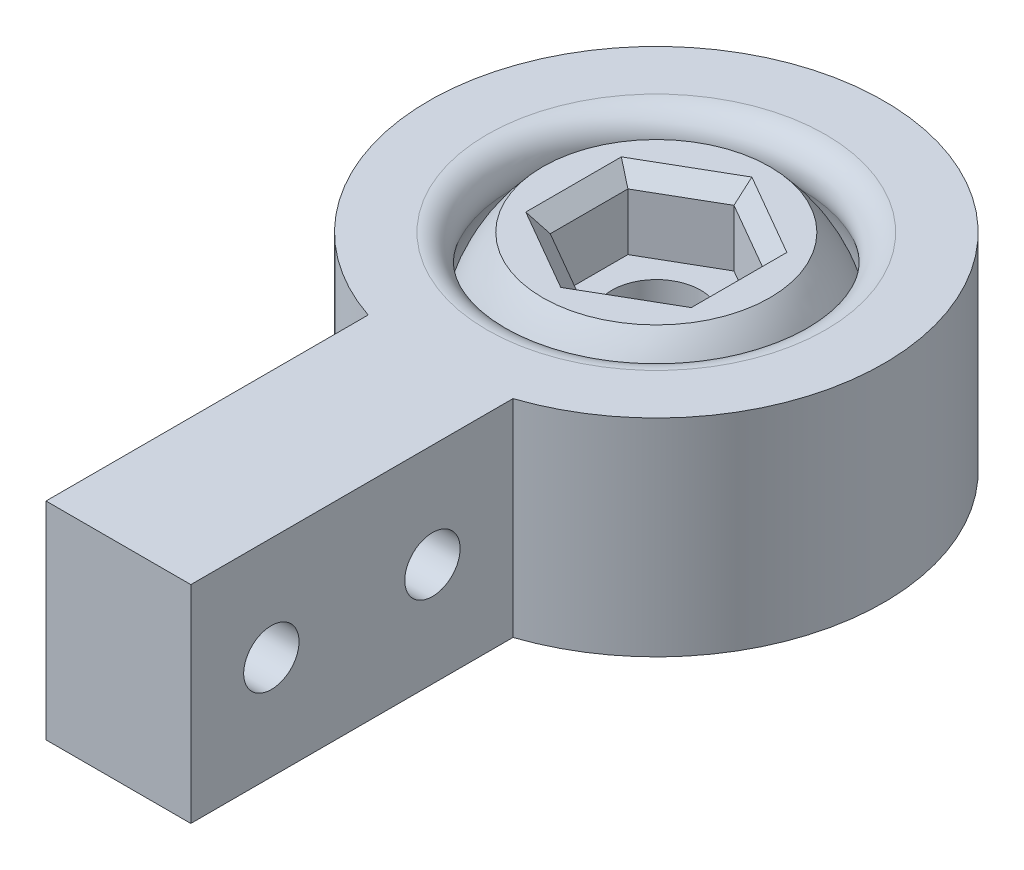
ISO-10303-21;
HEADER;
FILE_DESCRIPTION(('STEP AP214'),'2;1');
FILE_NAME('part.step','',(''),(''),'','','');
FILE_SCHEMA(('AUTOMOTIVE_DESIGN { 1 0 10303 214 1 1 1 1 }'));
ENDSEC;
DATA;
#1=APPLICATION_CONTEXT('core data for automotive mechanical design processes');
#2=APPLICATION_PROTOCOL_DEFINITION('international standard','automotive_design',2000,#1);
#3=PRODUCT_CONTEXT('',#1,'mechanical');
#4=PRODUCT('Part','Part','',(#3));
#5=PRODUCT_RELATED_PRODUCT_CATEGORY('part','',(#4));
#6=PRODUCT_DEFINITION_FORMATION('','',#4);
#7=PRODUCT_DEFINITION_CONTEXT('part definition',#1,'design');
#8=PRODUCT_DEFINITION('design','',#6,#7);
#9=PRODUCT_DEFINITION_SHAPE('','',#8);
#10=(LENGTH_UNIT() NAMED_UNIT(*) SI_UNIT(.MILLI.,.METRE.));
#11=(NAMED_UNIT(*) PLANE_ANGLE_UNIT() SI_UNIT($,.RADIAN.));
#12=(NAMED_UNIT(*) SI_UNIT($,.STERADIAN.) SOLID_ANGLE_UNIT());
#13=UNCERTAINTY_MEASURE_WITH_UNIT(LENGTH_MEASURE(1.E-05),#10,'distance_accuracy_value','');
#14=(GEOMETRIC_REPRESENTATION_CONTEXT(3) GLOBAL_UNCERTAINTY_ASSIGNED_CONTEXT((#13)) GLOBAL_UNIT_ASSIGNED_CONTEXT((#10,
#11,#12)) REPRESENTATION_CONTEXT('',''));
#15=CARTESIAN_POINT('',(0.,0.,0.));
#16=DIRECTION('',(0.,0.,1.));
#17=DIRECTION('',(1.,0.,0.));
#18=AXIS2_PLACEMENT_3D('',#15,#16,#17);
#19=CARTESIAN_POINT('',(0.,0.,0.));
#20=DIRECTION('',(0.,0.,-1.));
#21=DIRECTION('',(1.,0.,0.));
#22=AXIS2_PLACEMENT_3D('',#19,#20,#21);
#23=SPHERICAL_SURFACE('',#22,14.85);
#24=CARTESIAN_POINT('',(0.,0.,0.));
#25=DIRECTION('',(0.,1.,0.));
#26=DIRECTION('',(0.,0.,1.));
#27=AXIS2_PLACEMENT_3D('',#24,#25,#26);
#28=SPHERICAL_SURFACE('',#27,14.85);
#29=CARTESIAN_POINT('',(0.,10.,0.));
#30=DIRECTION('',(0.,1.,0.));
#31=DIRECTION('',(0.,0.,1.));
#32=AXIS2_PLACEMENT_3D('',#29,#30,#31);
#33=CIRCLE('',#32,10.9782739991312);
#34=CARTESIAN_POINT('',(0.,10.,10.9782739991312));
#35=VERTEX_POINT('',#34);
#36=EDGE_CURVE('E173',#35,#35,#33,.T.);
#37=ORIENTED_EDGE('',*,*,#36,.F.);
#38=EDGE_LOOP('',(#37));
#39=FACE_BOUND('',#38,.T.);
#40=CARTESIAN_POINT('',(0.,-10.,0.));
#41=DIRECTION('',(0.,-1.,0.));
#42=DIRECTION('',(0.,0.,-1.));
#43=AXIS2_PLACEMENT_3D('',#40,#41,#42);
#44=CIRCLE('',#43,10.9782739991312);
#45=CARTESIAN_POINT('',(0.,-10.,-10.9782739991312));
#46=VERTEX_POINT('',#45);
#47=EDGE_CURVE('E163',#46,#46,#44,.T.);
#48=ORIENTED_EDGE('',*,*,#47,.F.);
#49=EDGE_LOOP('',(#48));
#50=FACE_BOUND('',#49,.T.);
#51=ADVANCED_FACE('F54',(#39,#50),#28,.T.);
#52=CARTESIAN_POINT('',(0.,10.,0.));
#53=DIRECTION('',(0.,1.,0.));
#54=DIRECTION('',(0.,0.,1.));
#55=AXIS2_PLACEMENT_3D('',#52,#53,#54);
#56=PLANE('',#55);
#57=DIRECTION('',(0.,0.,1.));
#58=VECTOR('',#57,1.);
#59=CARTESIAN_POINT('',(8.,10.,3.75277674973257));
#60=LINE('',#59,#58);
#61=CARTESIAN_POINT('',(8.,10.,-4.61880215351701));
#62=VERTEX_POINT('',#61);
#63=CARTESIAN_POINT('',(8.,10.,4.61880215351701));
#64=VERTEX_POINT('',#63);
#65=EDGE_CURVE('E185',#62,#64,#60,.T.);
#66=ORIENTED_EDGE('',*,*,#65,.T.);
#67=DIRECTION('',(-0.866025403784439,0.,0.5));
#68=VECTOR('',#67,1.);
#69=CARTESIAN_POINT('',(0.749999999999999,10.,8.80459160514179));
#70=LINE('',#69,#68);
#71=CARTESIAN_POINT('',(0.,10.,9.23760430703401));
#72=VERTEX_POINT('',#71);
#73=EDGE_CURVE('E195',#64,#72,#70,.T.);
#74=ORIENTED_EDGE('',*,*,#73,.T.);
#75=DIRECTION('',(-0.866025403784439,0.,-0.5));
#76=VECTOR('',#75,1.);
#77=CARTESIAN_POINT('',(-7.25,10.,5.05181485540923));
#78=LINE('',#77,#76);
#79=CARTESIAN_POINT('',(-8.,10.,4.61880215351701));
#80=VERTEX_POINT('',#79);
#81=EDGE_CURVE('E193',#72,#80,#78,.T.);
#82=ORIENTED_EDGE('',*,*,#81,.T.);
#83=DIRECTION('',(0.,0.,-1.));
#84=VECTOR('',#83,1.);
#85=CARTESIAN_POINT('',(-8.,10.,-3.75277674973257));
#86=LINE('',#85,#84);
#87=CARTESIAN_POINT('',(-8.,10.,-4.61880215351701));
#88=VERTEX_POINT('',#87);
#89=EDGE_CURVE('E191',#80,#88,#86,.T.);
#90=ORIENTED_EDGE('',*,*,#89,.T.);
#91=DIRECTION('',(0.866025403784439,0.,-0.5));
#92=VECTOR('',#91,1.);
#93=CARTESIAN_POINT('',(-0.750000000000001,10.,-8.8045916051418));
#94=LINE('',#93,#92);
#95=CARTESIAN_POINT('',(0.,10.,-9.23760430703402));
#96=VERTEX_POINT('',#95);
#97=EDGE_CURVE('E189',#88,#96,#94,.T.);
#98=ORIENTED_EDGE('',*,*,#97,.T.);
#99=DIRECTION('',(0.866025403784439,0.,0.5));
#100=VECTOR('',#99,1.);
#101=CARTESIAN_POINT('',(7.25,10.,-5.05181485540923));
#102=LINE('',#101,#100);
#103=EDGE_CURVE('E187',#96,#62,#102,.T.);
#104=ORIENTED_EDGE('',*,*,#103,.T.);
#105=EDGE_LOOP('',(#66,#74,#82,#90,#98,#104));
#106=FACE_BOUND('',#105,.T.);
#107=ORIENTED_EDGE('',*,*,#36,.T.);
#108=EDGE_LOOP('',(#107));
#109=FACE_BOUND('',#108,.T.);
#110=ADVANCED_FACE('F229',(#106,#109),#56,.T.);
#111=CARTESIAN_POINT('',(0.,-10.,0.));
#112=DIRECTION('',(0.,-1.,0.));
#113=DIRECTION('',(0.,0.,-1.));
#114=AXIS2_PLACEMENT_3D('',#111,#112,#113);
#115=PLANE('',#114);
#116=CARTESIAN_POINT('',(0.,-10.,0.));
#117=DIRECTION('',(0.,-1.,0.));
#118=DIRECTION('',(0.,0.,-1.));
#119=AXIS2_PLACEMENT_3D('',#116,#117,#118);
#120=CIRCLE('',#119,7.62102355330306);
#121=CARTESIAN_POINT('',(0.,-10.,-7.62102355330306));
#122=VERTEX_POINT('',#121);
#123=EDGE_CURVE('E150',#122,#122,#120,.T.);
#124=ORIENTED_EDGE('',*,*,#123,.F.);
#125=EDGE_LOOP('',(#124));
#126=FACE_BOUND('',#125,.T.);
#127=ORIENTED_EDGE('',*,*,#47,.T.);
#128=EDGE_LOOP('',(#127));
#129=FACE_BOUND('',#128,.T.);
#130=ADVANCED_FACE('F262',(#126,#129),#115,.T.);
#131=CARTESIAN_POINT('',(0.,3.,0.));
#132=DIRECTION('',(0.,1.,0.));
#133=DIRECTION('',(0.,0.,1.));
#134=AXIS2_PLACEMENT_3D('',#131,#132,#133);
#135=PLANE('',#134);
#136=CARTESIAN_POINT('',(0.,3.,0.));
#137=DIRECTION('',(0.,1.,0.));
#138=DIRECTION('',(0.,0.,1.));
#139=AXIS2_PLACEMENT_3D('',#136,#137,#138);
#140=CIRCLE('',#139,4.3);
#141=CARTESIAN_POINT('',(0.,3.,4.3));
#142=VERTEX_POINT('',#141);
#143=EDGE_CURVE('E182',#142,#142,#140,.F.);
#144=ORIENTED_EDGE('',*,*,#143,.T.);
#145=EDGE_LOOP('',(#144));
#146=FACE_BOUND('',#145,.T.);
#147=DIRECTION('',(-0.866025403784439,0.,-0.5));
#148=VECTOR('',#147,1.);
#149=CARTESIAN_POINT('',(6.5,3.,-3.75277674973257));
#150=LINE('',#149,#148);
#151=CARTESIAN_POINT('',(6.5,3.,-3.75277674973257));
#152=VERTEX_POINT('',#151);
#153=CARTESIAN_POINT('',(0.,3.,-7.50555349946514));
#154=VERTEX_POINT('',#153);
#155=EDGE_CURVE('E128',#152,#154,#150,.T.);
#156=ORIENTED_EDGE('',*,*,#155,.T.);
#157=DIRECTION('',(-0.866025403784439,0.,0.5));
#158=VECTOR('',#157,1.);
#159=CARTESIAN_POINT('',(0.,3.,-7.50555349946514));
#160=LINE('',#159,#158);
#161=CARTESIAN_POINT('',(-6.5,3.,-3.75277674973257));
#162=VERTEX_POINT('',#161);
#163=EDGE_CURVE('E136',#154,#162,#160,.T.);
#164=ORIENTED_EDGE('',*,*,#163,.T.);
#165=DIRECTION('',(0.,0.,1.));
#166=VECTOR('',#165,1.);
#167=CARTESIAN_POINT('',(-6.5,3.,-3.75277674973257));
#168=LINE('',#167,#166);
#169=CARTESIAN_POINT('',(-6.5,3.,3.75277674973257));
#170=VERTEX_POINT('',#169);
#171=EDGE_CURVE('E142',#162,#170,#168,.T.);
#172=ORIENTED_EDGE('',*,*,#171,.T.);
#173=DIRECTION('',(0.866025403784439,0.,0.5));
#174=VECTOR('',#173,1.);
#175=CARTESIAN_POINT('',(-6.5,3.,3.75277674973257));
#176=LINE('',#175,#174);
#177=CARTESIAN_POINT('',(0.,3.,7.50555349946514));
#178=VERTEX_POINT('',#177);
#179=EDGE_CURVE('E155',#170,#178,#176,.T.);
#180=ORIENTED_EDGE('',*,*,#179,.T.);
#181=DIRECTION('',(0.866025403784439,0.,-0.5));
#182=VECTOR('',#181,1.);
#183=CARTESIAN_POINT('',(0.,3.,7.50555349946514));
#184=LINE('',#183,#182);
#185=CARTESIAN_POINT('',(6.5,3.,3.75277674973257));
#186=VERTEX_POINT('',#185);
#187=EDGE_CURVE('E158',#178,#186,#184,.T.);
#188=ORIENTED_EDGE('',*,*,#187,.T.);
#189=DIRECTION('',(0.,0.,-1.));
#190=VECTOR('',#189,1.);
#191=CARTESIAN_POINT('',(6.5,3.,3.75277674973257));
#192=LINE('',#191,#190);
#193=EDGE_CURVE('E133',#186,#152,#192,.T.);
#194=ORIENTED_EDGE('',*,*,#193,.T.);
#195=EDGE_LOOP('',(#156,#164,#172,#180,#188,#194));
#196=FACE_BOUND('',#195,.T.);
#197=ADVANCED_FACE('F144',(#146,#196),#135,.T.);
#198=CARTESIAN_POINT('',(6.5,3.,-3.75277674973257));
#199=DIRECTION('',(0.5,0.,-0.866025403784439));
#200=DIRECTION('',(-0.866025403784439,0.,-0.5));
#201=AXIS2_PLACEMENT_3D('',#198,#199,#200);
#202=PLANE('',#201);
#203=DIRECTION('',(0.,1.,0.));
#204=VECTOR('',#203,1.);
#205=CARTESIAN_POINT('',(6.5,3.,-3.75277674973257));
#206=LINE('',#205,#204);
#207=CARTESIAN_POINT('',(6.5,8.5,-3.75277674973257));
#208=VERTEX_POINT('',#207);
#209=EDGE_CURVE('E161',#152,#208,#206,.T.);
#210=ORIENTED_EDGE('',*,*,#209,.T.);
#211=DIRECTION('',(-0.866025403784439,0.,-0.5));
#212=VECTOR('',#211,1.);
#213=CARTESIAN_POINT('',(0.,8.5,-7.50555349946514));
#214=LINE('',#213,#212);
#215=CARTESIAN_POINT('',(0.,8.5,-7.50555349946514));
#216=VERTEX_POINT('',#215);
#217=EDGE_CURVE('E64',#208,#216,#214,.T.);
#218=ORIENTED_EDGE('',*,*,#217,.T.);
#219=DIRECTION('',(0.,1.,0.));
#220=VECTOR('',#219,1.);
#221=CARTESIAN_POINT('',(0.,3.,-7.50555349946514));
#222=LINE('',#221,#220);
#223=EDGE_CURVE('E124',#154,#216,#222,.T.);
#224=ORIENTED_EDGE('',*,*,#223,.F.);
#225=ORIENTED_EDGE('',*,*,#155,.F.);
#226=EDGE_LOOP('',(#210,#218,#224,#225));
#227=FACE_BOUND('',#226,.T.);
#228=ADVANCED_FACE('F126',(#227),#202,.F.);
#229=CARTESIAN_POINT('',(6.5,3.,3.75277674973257));
#230=DIRECTION('',(1.,0.,0.));
#231=DIRECTION('',(0.,0.,-1.));
#232=AXIS2_PLACEMENT_3D('',#229,#230,#231);
#233=PLANE('',#232);
#234=DIRECTION('',(0.,1.,0.));
#235=VECTOR('',#234,1.);
#236=CARTESIAN_POINT('',(6.5,3.,3.75277674973257));
#237=LINE('',#236,#235);
#238=CARTESIAN_POINT('',(6.5,8.5,3.75277674973257));
#239=VERTEX_POINT('',#238);
#240=EDGE_CURVE('E164',#186,#239,#237,.T.);
#241=ORIENTED_EDGE('',*,*,#240,.T.);
#242=DIRECTION('',(0.,0.,-1.));
#243=VECTOR('',#242,1.);
#244=CARTESIAN_POINT('',(6.5,8.5,-3.75277674973257));
#245=LINE('',#244,#243);
#246=EDGE_CURVE('E12',#239,#208,#245,.T.);
#247=ORIENTED_EDGE('',*,*,#246,.T.);
#248=ORIENTED_EDGE('',*,*,#209,.F.);
#249=ORIENTED_EDGE('',*,*,#193,.F.);
#250=EDGE_LOOP('',(#241,#247,#248,#249));
#251=FACE_BOUND('',#250,.T.);
#252=ADVANCED_FACE('F320',(#251),#233,.F.);
#253=CARTESIAN_POINT('',(0.,3.,7.50555349946514));
#254=DIRECTION('',(0.5,0.,0.866025403784439));
#255=DIRECTION('',(0.866025403784439,0.,-0.5));
#256=AXIS2_PLACEMENT_3D('',#253,#254,#255);
#257=PLANE('',#256);
#258=DIRECTION('',(0.,1.,0.));
#259=VECTOR('',#258,1.);
#260=CARTESIAN_POINT('',(0.,3.,7.50555349946514));
#261=LINE('',#260,#259);
#262=CARTESIAN_POINT('',(0.,8.5,7.50555349946514));
#263=VERTEX_POINT('',#262);
#264=EDGE_CURVE('E166',#178,#263,#261,.T.);
#265=ORIENTED_EDGE('',*,*,#264,.T.);
#266=DIRECTION('',(0.866025403784439,0.,-0.5));
#267=VECTOR('',#266,1.);
#268=CARTESIAN_POINT('',(6.5,8.5,3.75277674973257));
#269=LINE('',#268,#267);
#270=EDGE_CURVE('E176',#263,#239,#269,.T.);
#271=ORIENTED_EDGE('',*,*,#270,.T.);
#272=ORIENTED_EDGE('',*,*,#240,.F.);
#273=ORIENTED_EDGE('',*,*,#187,.F.);
#274=EDGE_LOOP('',(#265,#271,#272,#273));
#275=FACE_BOUND('',#274,.T.);
#276=ADVANCED_FACE('F244',(#275),#257,.F.);
#277=CARTESIAN_POINT('',(-6.5,3.,3.75277674973257));
#278=DIRECTION('',(-0.5,0.,0.866025403784439));
#279=DIRECTION('',(0.866025403784439,0.,0.5));
#280=AXIS2_PLACEMENT_3D('',#277,#278,#279);
#281=PLANE('',#280);
#282=DIRECTION('',(0.,1.,0.));
#283=VECTOR('',#282,1.);
#284=CARTESIAN_POINT('',(-6.5,3.,3.75277674973257));
#285=LINE('',#284,#283);
#286=CARTESIAN_POINT('',(-6.5,8.5,3.75277674973257));
#287=VERTEX_POINT('',#286);
#288=EDGE_CURVE('E169',#170,#287,#285,.T.);
#289=ORIENTED_EDGE('',*,*,#288,.T.);
#290=DIRECTION('',(0.866025403784439,0.,0.5));
#291=VECTOR('',#290,1.);
#292=CARTESIAN_POINT('',(0.,8.5,7.50555349946513));
#293=LINE('',#292,#291);
#294=EDGE_CURVE('E198',#287,#263,#293,.T.);
#295=ORIENTED_EDGE('',*,*,#294,.T.);
#296=ORIENTED_EDGE('',*,*,#264,.F.);
#297=ORIENTED_EDGE('',*,*,#179,.F.);
#298=EDGE_LOOP('',(#289,#295,#296,#297));
#299=FACE_BOUND('',#298,.T.);
#300=ADVANCED_FACE('F240',(#299),#281,.F.);
#301=CARTESIAN_POINT('',(-6.5,3.,-3.75277674973257));
#302=DIRECTION('',(-1.,0.,0.));
#303=DIRECTION('',(0.,0.,1.));
#304=AXIS2_PLACEMENT_3D('',#301,#302,#303);
#305=PLANE('',#304);
#306=DIRECTION('',(0.,1.,0.));
#307=VECTOR('',#306,1.);
#308=CARTESIAN_POINT('',(-6.5,3.,-3.75277674973257));
#309=LINE('',#308,#307);
#310=CARTESIAN_POINT('',(-6.5,8.5,-3.75277674973257));
#311=VERTEX_POINT('',#310);
#312=EDGE_CURVE('E132',#162,#311,#309,.T.);
#313=ORIENTED_EDGE('',*,*,#312,.T.);
#314=DIRECTION('',(0.,0.,1.));
#315=VECTOR('',#314,1.);
#316=CARTESIAN_POINT('',(-6.5,8.5,3.75277674973257));
#317=LINE('',#316,#315);
#318=EDGE_CURVE('E200',#311,#287,#317,.T.);
#319=ORIENTED_EDGE('',*,*,#318,.T.);
#320=ORIENTED_EDGE('',*,*,#288,.F.);
#321=ORIENTED_EDGE('',*,*,#171,.F.);
#322=EDGE_LOOP('',(#313,#319,#320,#321));
#323=FACE_BOUND('',#322,.T.);
#324=ADVANCED_FACE('F246',(#323),#305,.F.);
#325=CARTESIAN_POINT('',(0.,3.,-7.50555349946514));
#326=DIRECTION('',(-0.5,0.,-0.866025403784439));
#327=DIRECTION('',(-0.866025403784439,0.,0.5));
#328=AXIS2_PLACEMENT_3D('',#325,#326,#327);
#329=PLANE('',#328);
#330=ORIENTED_EDGE('',*,*,#223,.T.);
#331=DIRECTION('',(-0.866025403784439,0.,0.5));
#332=VECTOR('',#331,1.);
#333=CARTESIAN_POINT('',(-6.5,8.5,-3.75277674973257));
#334=LINE('',#333,#332);
#335=EDGE_CURVE('E202',#216,#311,#334,.T.);
#336=ORIENTED_EDGE('',*,*,#335,.T.);
#337=ORIENTED_EDGE('',*,*,#312,.F.);
#338=ORIENTED_EDGE('',*,*,#163,.F.);
#339=EDGE_LOOP('',(#330,#336,#337,#338));
#340=FACE_BOUND('',#339,.T.);
#341=ADVANCED_FACE('F137',(#340),#329,.F.);
#342=CARTESIAN_POINT('',(0.,-3.,0.));
#343=DIRECTION('',(0.,-1.,0.));
#344=DIRECTION('',(0.,0.,-1.));
#345=AXIS2_PLACEMENT_3D('',#342,#343,#344);
#346=PLANE('',#345);
#347=CARTESIAN_POINT('',(0.,-3.,0.));
#348=DIRECTION('',(0.,-1.,0.));
#349=DIRECTION('',(0.,0.,-1.));
#350=AXIS2_PLACEMENT_3D('',#347,#348,#349);
#351=CIRCLE('',#350,4.3);
#352=CARTESIAN_POINT('',(0.,-3.,-4.3));
#353=VERTEX_POINT('',#352);
#354=EDGE_CURVE('E179',#353,#353,#351,.F.);
#355=ORIENTED_EDGE('',*,*,#354,.T.);
#356=EDGE_LOOP('',(#355));
#357=FACE_BOUND('',#356,.T.);
#358=CARTESIAN_POINT('',(0.,-3.,0.));
#359=DIRECTION('',(0.,-1.,0.));
#360=DIRECTION('',(0.,0.,-1.));
#361=AXIS2_PLACEMENT_3D('',#358,#359,#360);
#362=CIRCLE('',#361,7.62102355330306);
#363=CARTESIAN_POINT('',(0.,-3.,-7.62102355330306));
#364=VERTEX_POINT('',#363);
#365=EDGE_CURVE('E147',#364,#364,#362,.T.);
#366=ORIENTED_EDGE('',*,*,#365,.T.);
#367=EDGE_LOOP('',(#366));
#368=FACE_BOUND('',#367,.T.);
#369=ADVANCED_FACE('F253',(#357,#368),#346,.T.);
#370=CARTESIAN_POINT('',(0.,-3.,0.));
#371=DIRECTION('',(0.,-1.,0.));
#372=DIRECTION('',(0.,0.,-1.));
#373=AXIS2_PLACEMENT_3D('',#370,#371,#372);
#374=CYLINDRICAL_SURFACE('',#373,7.62102355330306);
#375=ORIENTED_EDGE('',*,*,#365,.F.);
#376=EDGE_LOOP('',(#375));
#377=FACE_BOUND('',#376,.T.);
#378=ORIENTED_EDGE('',*,*,#123,.T.);
#379=EDGE_LOOP('',(#378));
#380=FACE_BOUND('',#379,.T.);
#381=ADVANCED_FACE('F303',(#377,#380),#374,.F.);
#382=CARTESIAN_POINT('',(0.,-10.,0.));
#383=DIRECTION('',(0.,1.,0.));
#384=DIRECTION('',(0.,0.,1.));
#385=AXIS2_PLACEMENT_3D('',#382,#383,#384);
#386=CYLINDRICAL_SURFACE('',#385,4.3);
#387=ORIENTED_EDGE('',*,*,#143,.F.);
#388=EDGE_LOOP('',(#387));
#389=FACE_BOUND('',#388,.T.);
#390=ORIENTED_EDGE('',*,*,#354,.F.);
#391=EDGE_LOOP('',(#390));
#392=FACE_BOUND('',#391,.T.);
#393=ADVANCED_FACE('F299',(#389,#392),#386,.F.);
#394=CARTESIAN_POINT('',(0.,8.5,-7.50555349946514));
#395=DIRECTION('',(0.353553390593274,0.707106781186547,0.612372435695795));
#396=DIRECTION('',(0.866025403784439,0.,-0.5));
#397=AXIS2_PLACEMENT_3D('',#394,#395,#396);
#398=PLANE('',#397);
#399=DIRECTION('',(0.,-0.654653670707978,0.755928946018454));
#400=VECTOR('',#399,1.);
#401=CARTESIAN_POINT('',(0.,8.5,-7.50555349946514));
#402=LINE('',#401,#400);
#403=EDGE_CURVE('E214',#96,#216,#402,.T.);
#404=ORIENTED_EDGE('',*,*,#403,.F.);
#405=ORIENTED_EDGE('',*,*,#97,.F.);
#406=DIRECTION('',(0.654653670707977,-0.654653670707977,0.377964473009227));
#407=VECTOR('',#406,1.);
#408=CARTESIAN_POINT('',(-6.5,8.5,-3.75277674973257));
#409=LINE('',#408,#407);
#410=EDGE_CURVE('E59',#311,#88,#409,.F.);
#411=ORIENTED_EDGE('',*,*,#410,.F.);
#412=ORIENTED_EDGE('',*,*,#335,.F.);
#413=EDGE_LOOP('',(#404,#405,#411,#412));
#414=FACE_BOUND('',#413,.T.);
#415=ADVANCED_FACE('F57',(#414),#398,.T.);
#416=CARTESIAN_POINT('',(-6.5,8.5,-3.75277674973257));
#417=DIRECTION('',(0.707106781186547,0.707106781186547,0.));
#418=DIRECTION('',(0.,0.,-1.));
#419=AXIS2_PLACEMENT_3D('',#416,#417,#418);
#420=PLANE('',#419);
#421=ORIENTED_EDGE('',*,*,#410,.T.);
#422=ORIENTED_EDGE('',*,*,#89,.F.);
#423=DIRECTION('',(0.654653670707977,-0.654653670707977,-0.377964473009227));
#424=VECTOR('',#423,1.);
#425=CARTESIAN_POINT('',(-6.5,8.5,3.75277674973257));
#426=LINE('',#425,#424);
#427=EDGE_CURVE('E212',#287,#80,#426,.F.);
#428=ORIENTED_EDGE('',*,*,#427,.F.);
#429=ORIENTED_EDGE('',*,*,#318,.F.);
#430=EDGE_LOOP('',(#421,#422,#428,#429));
#431=FACE_BOUND('',#430,.T.);
#432=ADVANCED_FACE('F224',(#431),#420,.T.);
#433=CARTESIAN_POINT('',(6.5,8.5,-3.75277674973257));
#434=DIRECTION('',(-0.353553390593274,0.707106781186547,0.612372435695795));
#435=DIRECTION('',(0.866025403784439,0.,0.5));
#436=AXIS2_PLACEMENT_3D('',#433,#434,#435);
#437=PLANE('',#436);
#438=ORIENTED_EDGE('',*,*,#403,.T.);
#439=ORIENTED_EDGE('',*,*,#217,.F.);
#440=DIRECTION('',(-0.654653670707977,-0.654653670707977,0.377964473009226));
#441=VECTOR('',#440,1.);
#442=CARTESIAN_POINT('',(6.5,8.5,-3.75277674973257));
#443=LINE('',#442,#441);
#444=EDGE_CURVE('E209',#62,#208,#443,.T.);
#445=ORIENTED_EDGE('',*,*,#444,.F.);
#446=ORIENTED_EDGE('',*,*,#103,.F.);
#447=EDGE_LOOP('',(#438,#439,#445,#446));
#448=FACE_BOUND('',#447,.T.);
#449=ADVANCED_FACE('F288',(#448),#437,.T.);
#450=CARTESIAN_POINT('',(-6.5,8.5,3.75277674973257));
#451=DIRECTION('',(0.353553390593274,0.707106781186547,-0.612372435695795));
#452=DIRECTION('',(-0.866025403784439,0.,-0.5));
#453=AXIS2_PLACEMENT_3D('',#450,#451,#452);
#454=PLANE('',#453);
#455=ORIENTED_EDGE('',*,*,#427,.T.);
#456=ORIENTED_EDGE('',*,*,#81,.F.);
#457=DIRECTION('',(0.,-0.654653670707977,-0.755928946018454));
#458=VECTOR('',#457,1.);
#459=CARTESIAN_POINT('',(0.,8.5,7.50555349946514));
#460=LINE('',#459,#458);
#461=EDGE_CURVE('E207',#263,#72,#460,.F.);
#462=ORIENTED_EDGE('',*,*,#461,.F.);
#463=ORIENTED_EDGE('',*,*,#294,.F.);
#464=EDGE_LOOP('',(#455,#456,#462,#463));
#465=FACE_BOUND('',#464,.T.);
#466=ADVANCED_FACE('F236',(#465),#454,.T.);
#467=CARTESIAN_POINT('',(6.5,8.5,3.75277674973257));
#468=DIRECTION('',(-0.707106781186547,0.707106781186548,0.));
#469=DIRECTION('',(0.,0.,1.));
#470=AXIS2_PLACEMENT_3D('',#467,#468,#469);
#471=PLANE('',#470);
#472=ORIENTED_EDGE('',*,*,#444,.T.);
#473=ORIENTED_EDGE('',*,*,#246,.F.);
#474=DIRECTION('',(0.654653670707977,0.654653670707977,0.377964473009227));
#475=VECTOR('',#474,1.);
#476=CARTESIAN_POINT('',(4.64285714285714,6.64285714285714,2.68055482123755));
#477=LINE('',#476,#475);
#478=EDGE_CURVE('E205',#64,#239,#477,.F.);
#479=ORIENTED_EDGE('',*,*,#478,.F.);
#480=ORIENTED_EDGE('',*,*,#65,.F.);
#481=EDGE_LOOP('',(#472,#473,#479,#480));
#482=FACE_BOUND('',#481,.T.);
#483=ADVANCED_FACE('F275',(#482),#471,.T.);
#484=CARTESIAN_POINT('',(0.,8.5,7.50555349946514));
#485=DIRECTION('',(-0.353553390593274,0.707106781186548,-0.612372435695795));
#486=DIRECTION('',(-0.866025403784439,0.,0.5));
#487=AXIS2_PLACEMENT_3D('',#484,#485,#486);
#488=PLANE('',#487);
#489=ORIENTED_EDGE('',*,*,#461,.T.);
#490=ORIENTED_EDGE('',*,*,#73,.F.);
#491=ORIENTED_EDGE('',*,*,#478,.T.);
#492=ORIENTED_EDGE('',*,*,#270,.F.);
#493=EDGE_LOOP('',(#489,#490,#491,#492));
#494=FACE_BOUND('',#493,.T.);
#495=ADVANCED_FACE('F269',(#494),#488,.T.);
#496=CLOSED_SHELL('',(#51,#110,#130,#197,#228,#252,#276,#300,#324,#341,#369,#381,#393,#415,#432,
#449,#466,#483,#495));
#497=MANIFOLD_SOLID_BREP('B2',#496);
#498=CARTESIAN_POINT('',(7.,-40.,52.));
#499=DIRECTION('',(1.,0.,0.));
#500=DIRECTION('',(0.,0.,-1.));
#501=AXIS2_PLACEMENT_3D('',#498,#499,#500);
#502=PLANE('',#501);
#503=CARTESIAN_POINT('',(7.,0.,28.6424902109607));
#504=DIRECTION('',(1.,0.,0.));
#505=DIRECTION('',(0.,0.,-1.));
#506=AXIS2_PLACEMENT_3D('',#503,#504,#505);
#507=CIRCLE('',#506,2.675);
#508=CARTESIAN_POINT('',(7.,0.,25.9674902109607));
#509=VERTEX_POINT('',#508);
#510=EDGE_CURVE('E530',#509,#509,#507,.F.);
#511=ORIENTED_EDGE('',*,*,#510,.T.);
#512=EDGE_LOOP('',(#511));
#513=FACE_BOUND('',#512,.T.);
#514=DIRECTION('',(0.,1.,0.));
#515=VECTOR('',#514,1.);
#516=CARTESIAN_POINT('',(7.,-40.,20.8566536146142));
#517=LINE('',#516,#515);
#518=CARTESIAN_POINT('',(7.,-10.,20.8566536146142));
#519=VERTEX_POINT('',#518);
#520=CARTESIAN_POINT('',(7.,10.,20.8566536146142));
#521=VERTEX_POINT('',#520);
#522=EDGE_CURVE('E495',#519,#521,#517,.T.);
#523=ORIENTED_EDGE('',*,*,#522,.T.);
#524=DIRECTION('',(0.,0.,-1.));
#525=VECTOR('',#524,1.);
#526=CARTESIAN_POINT('',(7.,10.,52.));
#527=LINE('',#526,#525);
#528=CARTESIAN_POINT('',(7.,10.,52.));
#529=VERTEX_POINT('',#528);
#530=EDGE_CURVE('E499',#529,#521,#527,.T.);
#531=ORIENTED_EDGE('',*,*,#530,.F.);
#532=DIRECTION('',(0.,1.,0.));
#533=VECTOR('',#532,1.);
#534=CARTESIAN_POINT('',(7.,-40.,52.));
#535=LINE('',#534,#533);
#536=CARTESIAN_POINT('',(7.,-10.,52.));
#537=VERTEX_POINT('',#536);
#538=EDGE_CURVE('E488',#537,#529,#535,.T.);
#539=ORIENTED_EDGE('',*,*,#538,.F.);
#540=DIRECTION('',(0.,0.,1.));
#541=VECTOR('',#540,1.);
#542=CARTESIAN_POINT('',(7.,-10.,0.));
#543=LINE('',#542,#541);
#544=EDGE_CURVE('E521',#519,#537,#543,.T.);
#545=ORIENTED_EDGE('',*,*,#544,.F.);
#546=EDGE_LOOP('',(#523,#531,#539,#545));
#547=FACE_BOUND('',#546,.T.);
#548=CARTESIAN_POINT('',(7.,0.,44.2141634036536));
#549=DIRECTION('',(1.,0.,0.));
#550=DIRECTION('',(0.,0.,-1.));
#551=AXIS2_PLACEMENT_3D('',#548,#549,#550);
#552=CIRCLE('',#551,2.675);
#553=CARTESIAN_POINT('',(7.,0.,41.5391634036536));
#554=VERTEX_POINT('',#553);
#555=EDGE_CURVE('E534',#554,#554,#552,.T.);
#556=ORIENTED_EDGE('',*,*,#555,.F.);
#557=EDGE_LOOP('',(#556));
#558=FACE_BOUND('',#557,.T.);
#559=ADVANCED_FACE('F448',(#513,#547,#558),#502,.T.);
#560=CARTESIAN_POINT('',(-7.,-40.,20.8566536146142));
#561=DIRECTION('',(-1.,0.,0.));
#562=DIRECTION('',(0.,0.,1.));
#563=AXIS2_PLACEMENT_3D('',#560,#561,#562);
#564=PLANE('',#563);
#565=CARTESIAN_POINT('',(-7.,0.,28.6424902109607));
#566=DIRECTION('',(-1.,0.,0.));
#567=DIRECTION('',(0.,0.,1.));
#568=AXIS2_PLACEMENT_3D('',#565,#566,#567);
#569=CIRCLE('',#568,2.675);
#570=CARTESIAN_POINT('',(-7.,0.,25.9674902109607));
#571=VERTEX_POINT('',#570);
#572=EDGE_CURVE('E527',#571,#571,#569,.F.);
#573=ORIENTED_EDGE('',*,*,#572,.T.);
#574=EDGE_LOOP('',(#573));
#575=FACE_BOUND('',#574,.T.);
#576=DIRECTION('',(0.,1.,0.));
#577=VECTOR('',#576,1.);
#578=CARTESIAN_POINT('',(-7.,-40.,52.));
#579=LINE('',#578,#577);
#580=CARTESIAN_POINT('',(-7.,-10.,52.));
#581=VERTEX_POINT('',#580);
#582=CARTESIAN_POINT('',(-7.,10.,52.));
#583=VERTEX_POINT('',#582);
#584=EDGE_CURVE('E496',#581,#583,#579,.T.);
#585=ORIENTED_EDGE('',*,*,#584,.T.);
#586=DIRECTION('',(0.,0.,1.));
#587=VECTOR('',#586,1.);
#588=CARTESIAN_POINT('',(-7.,10.,20.8566536146142));
#589=LINE('',#588,#587);
#590=CARTESIAN_POINT('',(-7.,10.,20.8566536146142));
#591=VERTEX_POINT('',#590);
#592=EDGE_CURVE('E508',#591,#583,#589,.T.);
#593=ORIENTED_EDGE('',*,*,#592,.F.);
#594=DIRECTION('',(0.,1.,0.));
#595=VECTOR('',#594,1.);
#596=CARTESIAN_POINT('',(-7.,-40.,20.8566536146142));
#597=LINE('',#596,#595);
#598=CARTESIAN_POINT('',(-7.,-10.,20.8566536146142));
#599=VERTEX_POINT('',#598);
#600=EDGE_CURVE('E471',#599,#591,#597,.T.);
#601=ORIENTED_EDGE('',*,*,#600,.F.);
#602=DIRECTION('',(0.,0.,-1.));
#603=VECTOR('',#602,1.);
#604=CARTESIAN_POINT('',(-7.,-10.,0.));
#605=LINE('',#604,#603);
#606=EDGE_CURVE('E514',#581,#599,#605,.T.);
#607=ORIENTED_EDGE('',*,*,#606,.F.);
#608=EDGE_LOOP('',(#585,#593,#601,#607));
#609=FACE_BOUND('',#608,.T.);
#610=CARTESIAN_POINT('',(-7.,0.,44.2141634036536));
#611=DIRECTION('',(-1.,0.,0.));
#612=DIRECTION('',(0.,0.,1.));
#613=AXIS2_PLACEMENT_3D('',#610,#611,#612);
#614=CIRCLE('',#613,2.675);
#615=CARTESIAN_POINT('',(-7.,0.,41.5391634036536));
#616=VERTEX_POINT('',#615);
#617=EDGE_CURVE('E531',#616,#616,#614,.T.);
#618=ORIENTED_EDGE('',*,*,#617,.F.);
#619=EDGE_LOOP('',(#618));
#620=FACE_BOUND('',#619,.T.);
#621=ADVANCED_FACE('F564',(#575,#609,#620),#564,.T.);
#622=CARTESIAN_POINT('',(0.,10.,0.));
#623=DIRECTION('',(0.,1.,0.));
#624=DIRECTION('',(0.,0.,1.));
#625=AXIS2_PLACEMENT_3D('',#622,#623,#624);
#626=PLANE('',#625);
#627=CARTESIAN_POINT('',(0.,10.,0.));
#628=DIRECTION('',(0.,1.,0.));
#629=DIRECTION('',(0.,0.,1.));
#630=AXIS2_PLACEMENT_3D('',#627,#628,#629);
#631=CIRCLE('',#630,16.3630681719536);
#632=CARTESIAN_POINT('',(0.,10.,16.3630681719536));
#633=VERTEX_POINT('',#632);
#634=EDGE_CURVE('E52',#633,#633,#631,.F.);
#635=ORIENTED_EDGE('',*,*,#634,.T.);
#636=EDGE_LOOP('',(#635));
#637=FACE_BOUND('',#636,.T.);
#638=ORIENTED_EDGE('',*,*,#530,.T.);
#639=CARTESIAN_POINT('',(0.,10.,0.));
#640=DIRECTION('',(0.,1.,0.));
#641=DIRECTION('',(0.,0.,1.));
#642=AXIS2_PLACEMENT_3D('',#639,#640,#641);
#643=CIRCLE('',#642,22.);
#644=EDGE_CURVE('E510',#521,#591,#643,.T.);
#645=ORIENTED_EDGE('',*,*,#644,.T.);
#646=ORIENTED_EDGE('',*,*,#592,.T.);
#647=DIRECTION('',(1.,0.,0.));
#648=VECTOR('',#647,1.);
#649=CARTESIAN_POINT('',(-7.,10.,52.));
#650=LINE('',#649,#648);
#651=EDGE_CURVE('E463',#583,#529,#650,.T.);
#652=ORIENTED_EDGE('',*,*,#651,.T.);
#653=EDGE_LOOP('',(#638,#645,#646,#652));
#654=FACE_BOUND('',#653,.T.);
#655=ADVANCED_FACE('F507',(#637,#654),#626,.T.);
#656=CARTESIAN_POINT('',(0.,-10.,0.));
#657=DIRECTION('',(0.,-1.,0.));
#658=DIRECTION('',(0.,0.,-1.));
#659=AXIS2_PLACEMENT_3D('',#656,#657,#658);
#660=PLANE('',#659);
#661=CARTESIAN_POINT('',(0.,-10.,0.));
#662=DIRECTION('',(0.,-1.,0.));
#663=DIRECTION('',(0.,0.,-1.));
#664=AXIS2_PLACEMENT_3D('',#661,#662,#663);
#665=CIRCLE('',#664,16.3630681719536);
#666=CARTESIAN_POINT('',(0.,-10.,-16.3630681719536));
#667=VERTEX_POINT('',#666);
#668=EDGE_CURVE('E456',#667,#667,#665,.F.);
#669=ORIENTED_EDGE('',*,*,#668,.T.);
#670=EDGE_LOOP('',(#669));
#671=FACE_BOUND('',#670,.T.);
#672=ORIENTED_EDGE('',*,*,#606,.T.);
#673=CARTESIAN_POINT('',(0.,-10.,0.));
#674=DIRECTION('',(0.,-1.,0.));
#675=DIRECTION('',(0.,0.,-1.));
#676=AXIS2_PLACEMENT_3D('',#673,#674,#675);
#677=CIRCLE('',#676,22.);
#678=EDGE_CURVE('E523',#599,#519,#677,.T.);
#679=ORIENTED_EDGE('',*,*,#678,.T.);
#680=ORIENTED_EDGE('',*,*,#544,.T.);
#681=DIRECTION('',(-1.,0.,0.));
#682=VECTOR('',#681,1.);
#683=CARTESIAN_POINT('',(0.,-10.,52.));
#684=LINE('',#683,#682);
#685=EDGE_CURVE('E492',#537,#581,#684,.T.);
#686=ORIENTED_EDGE('',*,*,#685,.T.);
#687=EDGE_LOOP('',(#672,#679,#680,#686));
#688=FACE_BOUND('',#687,.T.);
#689=ADVANCED_FACE('F542',(#671,#688),#660,.T.);
#690=CARTESIAN_POINT('',(0.,0.,0.));
#691=DIRECTION('',(0.,0.,-1.));
#692=DIRECTION('',(1.,0.,0.));
#693=AXIS2_PLACEMENT_3D('',#690,#691,#692);
#694=SPHERICAL_SURFACE('',#693,15.5);
#695=CARTESIAN_POINT('',(0.,0.,0.));
#696=DIRECTION('',(0.,1.,0.));
#697=DIRECTION('',(0.,0.,1.));
#698=AXIS2_PLACEMENT_3D('',#695,#696,#697);
#699=SPHERICAL_SURFACE('',#698,15.5);
#700=CARTESIAN_POINT('',(0.,-6.45833333333333,0.));
#701=DIRECTION('',(0.,1.,0.));
#702=DIRECTION('',(0.,0.,1.));
#703=AXIS2_PLACEMENT_3D('',#700,#701,#702);
#704=CIRCLE('',#703,14.0904198147378);
#705=CARTESIAN_POINT('',(0.,-6.45833333333333,14.0904198147378));
#706=VERTEX_POINT('',#705);
#707=EDGE_CURVE('E537',#706,#706,#704,.F.);
#708=ORIENTED_EDGE('',*,*,#707,.T.);
#709=EDGE_LOOP('',(#708));
#710=FACE_BOUND('',#709,.T.);
#711=CARTESIAN_POINT('',(0.,6.45833333333333,0.));
#712=DIRECTION('',(0.,-1.,0.));
#713=DIRECTION('',(0.,0.,-1.));
#714=AXIS2_PLACEMENT_3D('',#711,#712,#713);
#715=CIRCLE('',#714,14.0904198147378);
#716=CARTESIAN_POINT('',(0.,6.45833333333333,-14.0904198147378));
#717=VERTEX_POINT('',#716);
#718=EDGE_CURVE('E526',#717,#717,#715,.F.);
#719=ORIENTED_EDGE('',*,*,#718,.T.);
#720=EDGE_LOOP('',(#719));
#721=FACE_BOUND('',#720,.T.);
#722=ADVANCED_FACE('F551',(#710,#721),#699,.F.);
#723=CARTESIAN_POINT('',(0.,-40.,0.));
#724=DIRECTION('',(0.,1.,0.));
#725=DIRECTION('',(0.,0.,1.));
#726=AXIS2_PLACEMENT_3D('',#723,#724,#725);
#727=CYLINDRICAL_SURFACE('',#726,22.);
#728=ORIENTED_EDGE('',*,*,#600,.T.);
#729=ORIENTED_EDGE('',*,*,#644,.F.);
#730=ORIENTED_EDGE('',*,*,#522,.F.);
#731=ORIENTED_EDGE('',*,*,#678,.F.);
#732=EDGE_LOOP('',(#728,#729,#730,#731));
#733=FACE_BOUND('',#732,.T.);
#734=ADVANCED_FACE('F554',(#733),#727,.T.);
#735=CARTESIAN_POINT('',(-7.,-40.,52.));
#736=DIRECTION('',(0.,0.,1.));
#737=DIRECTION('',(1.,0.,0.));
#738=AXIS2_PLACEMENT_3D('',#735,#736,#737);
#739=PLANE('',#738);
#740=ORIENTED_EDGE('',*,*,#538,.T.);
#741=ORIENTED_EDGE('',*,*,#651,.F.);
#742=ORIENTED_EDGE('',*,*,#584,.F.);
#743=ORIENTED_EDGE('',*,*,#685,.F.);
#744=EDGE_LOOP('',(#740,#741,#742,#743));
#745=FACE_BOUND('',#744,.T.);
#746=ADVANCED_FACE('F490',(#745),#739,.T.);
#747=CARTESIAN_POINT('',(-22.,0.,28.6424902109607));
#748=DIRECTION('',(1.,0.,0.));
#749=DIRECTION('',(0.,0.,-1.));
#750=AXIS2_PLACEMENT_3D('',#747,#748,#749);
#751=CYLINDRICAL_SURFACE('',#750,2.675);
#752=CARTESIAN_POINT('',(7.,0.,25.9674902109607));
#753=CARTESIAN_POINT('',(6.85416666666667,0.,25.9674902109607));
#754=CARTESIAN_POINT('',(6.70833333333333,0.,25.9674902109607));
#755=CARTESIAN_POINT('',(6.41666666666667,0.,25.9674902109607));
#756=CARTESIAN_POINT('',(6.27083333333333,0.,25.9674902109607));
#757=CARTESIAN_POINT('',(5.97916666666667,0.,25.9674902109607));
#758=CARTESIAN_POINT('',(5.83333333333333,0.,25.9674902109607));
#759=CARTESIAN_POINT('',(5.54166666666666,0.,25.9674902109607));
#760=CARTESIAN_POINT('',(5.39583333333333,0.,25.9674902109607));
#761=CARTESIAN_POINT('',(5.10416666666667,0.,25.9674902109607));
#762=CARTESIAN_POINT('',(4.95833333333333,0.,25.9674902109607));
#763=CARTESIAN_POINT('',(4.66666666666667,0.,25.9674902109607));
#764=CARTESIAN_POINT('',(4.52083333333333,0.,25.9674902109607));
#765=CARTESIAN_POINT('',(4.22916666666667,0.,25.9674902109607));
#766=CARTESIAN_POINT('',(4.08333333333333,0.,25.9674902109607));
#767=CARTESIAN_POINT('',(3.79166666666667,0.,25.9674902109607));
#768=CARTESIAN_POINT('',(3.64583333333333,0.,25.9674902109607));
#769=CARTESIAN_POINT('',(3.35416666666667,0.,25.9674902109607));
#770=CARTESIAN_POINT('',(3.20833333333333,0.,25.9674902109607));
#771=CARTESIAN_POINT('',(2.91666666666667,0.,25.9674902109607));
#772=CARTESIAN_POINT('',(2.77083333333333,0.,25.9674902109607));
#773=CARTESIAN_POINT('',(2.47916666666667,0.,25.9674902109607));
#774=CARTESIAN_POINT('',(2.33333333333333,0.,25.9674902109607));
#775=CARTESIAN_POINT('',(2.04166666666667,0.,25.9674902109607));
#776=CARTESIAN_POINT('',(1.89583333333333,0.,25.9674902109607));
#777=CARTESIAN_POINT('',(1.60416666666667,0.,25.9674902109607));
#778=CARTESIAN_POINT('',(1.45833333333333,0.,25.9674902109607));
#779=CARTESIAN_POINT('',(1.16666666666667,0.,25.9674902109607));
#780=CARTESIAN_POINT('',(1.02083333333333,0.,25.9674902109607));
#781=CARTESIAN_POINT('',(0.729166666666667,0.,25.9674902109607));
#782=CARTESIAN_POINT('',(0.583333333333334,0.,25.9674902109607));
#783=CARTESIAN_POINT('',(0.291666666666667,0.,25.9674902109607));
#784=CARTESIAN_POINT('',(0.145833333333333,0.,25.9674902109607));
#785=CARTESIAN_POINT('',(-0.145833333333333,0.,25.9674902109607));
#786=CARTESIAN_POINT('',(-0.291666666666667,0.,25.9674902109607));
#787=CARTESIAN_POINT('',(-0.583333333333334,0.,25.9674902109607));
#788=CARTESIAN_POINT('',(-0.729166666666667,0.,25.9674902109607));
#789=CARTESIAN_POINT('',(-1.02083333333333,0.,25.9674902109607));
#790=CARTESIAN_POINT('',(-1.16666666666667,0.,25.9674902109607));
#791=CARTESIAN_POINT('',(-1.45833333333333,0.,25.9674902109607));
#792=CARTESIAN_POINT('',(-1.60416666666667,0.,25.9674902109607));
#793=CARTESIAN_POINT('',(-1.89583333333333,0.,25.9674902109607));
#794=CARTESIAN_POINT('',(-2.04166666666667,0.,25.9674902109607));
#795=CARTESIAN_POINT('',(-2.33333333333333,0.,25.9674902109607));
#796=CARTESIAN_POINT('',(-2.47916666666667,0.,25.9674902109607));
#797=CARTESIAN_POINT('',(-2.77083333333333,0.,25.9674902109607));
#798=CARTESIAN_POINT('',(-2.91666666666667,0.,25.9674902109607));
#799=CARTESIAN_POINT('',(-3.20833333333333,0.,25.9674902109607));
#800=CARTESIAN_POINT('',(-3.35416666666667,0.,25.9674902109607));
#801=CARTESIAN_POINT('',(-3.64583333333333,0.,25.9674902109607));
#802=CARTESIAN_POINT('',(-3.79166666666667,0.,25.9674902109607));
#803=CARTESIAN_POINT('',(-4.08333333333333,0.,25.9674902109607));
#804=CARTESIAN_POINT('',(-4.22916666666667,0.,25.9674902109607));
#805=CARTESIAN_POINT('',(-4.52083333333333,0.,25.9674902109607));
#806=CARTESIAN_POINT('',(-4.66666666666667,0.,25.9674902109607));
#807=CARTESIAN_POINT('',(-4.95833333333333,0.,25.9674902109607));
#808=CARTESIAN_POINT('',(-5.10416666666666,0.,25.9674902109607));
#809=CARTESIAN_POINT('',(-5.39583333333333,0.,25.9674902109607));
#810=CARTESIAN_POINT('',(-5.54166666666666,0.,25.9674902109607));
#811=CARTESIAN_POINT('',(-5.83333333333333,0.,25.9674902109607));
#812=CARTESIAN_POINT('',(-5.97916666666667,0.,25.9674902109607));
#813=CARTESIAN_POINT('',(-6.27083333333333,0.,25.9674902109607));
#814=CARTESIAN_POINT('',(-6.41666666666667,0.,25.9674902109607));
#815=CARTESIAN_POINT('',(-6.70833333333333,0.,25.9674902109607));
#816=CARTESIAN_POINT('',(-6.85416666666667,0.,25.9674902109607));
#817=CARTESIAN_POINT('',(-7.,0.,25.9674902109607));
#818=B_SPLINE_CURVE_WITH_KNOTS('',3,(#752,#753,#754,#755,#756,#757,#758,#759,#760,#761,#762,
#763,#764,#765,#766,#767,#768,#769,#770,#771,#772,#773,#774,#775,#776,#777,#778,#779,#780,#781,
#782,#783,#784,#785,#786,#787,#788,#789,#790,#791,#792,#793,#794,#795,#796,#797,#798,#799,#800,
#801,#802,#803,#804,#805,#806,#807,#808,#809,#810,#811,#812,#813,#814,#815,#816,#817),
.UNSPECIFIED.,.F.,.F.,(4,2,2,2,2,2,2,2,2,2,2,2,2,2,2,2,2,2,2,2,2,2,2,2,2,2,2,2,2,2,2,2,4),(0.,
0.4375,0.875000000000001,1.3125,1.75,2.1875,2.625,3.0625,3.5,3.9375,4.375,4.8125,5.25,5.6875,
6.125,6.5625,7.,7.4375,7.875,8.3125,8.75,9.1875,9.625,10.0625,10.5,10.9375,11.375,11.8125,12.25,
12.6875,13.125,13.5625,14.),.UNSPECIFIED.);
#819=EDGE_CURVE('BSEAM575',#509,#571,#818,.T.);
#820=ORIENTED_EDGE('',*,*,#510,.F.);
#821=ORIENTED_EDGE('',*,*,#572,.F.);
#822=ORIENTED_EDGE('',*,*,#819,.T.);
#823=ORIENTED_EDGE('',*,*,#819,.F.);
#824=EDGE_LOOP('',(#820,#822,#821,#823));
#825=FACE_BOUND('',#824,.T.);
#826=ADVANCED_FACE('F575',(#825),#751,.F.);
#827=CARTESIAN_POINT('',(-22.,0.,44.2141634036536));
#828=DIRECTION('',(1.,0.,0.));
#829=DIRECTION('',(0.,0.,-1.));
#830=AXIS2_PLACEMENT_3D('',#827,#828,#829);
#831=CYLINDRICAL_SURFACE('',#830,2.675);
#832=CARTESIAN_POINT('',(7.,0.,41.5391634036536));
#833=CARTESIAN_POINT('',(6.85416666666667,0.,41.5391634036536));
#834=CARTESIAN_POINT('',(6.70833333333333,0.,41.5391634036536));
#835=CARTESIAN_POINT('',(6.41666666666667,0.,41.5391634036536));
#836=CARTESIAN_POINT('',(6.27083333333333,0.,41.5391634036536));
#837=CARTESIAN_POINT('',(5.97916666666667,0.,41.5391634036536));
#838=CARTESIAN_POINT('',(5.83333333333333,0.,41.5391634036536));
#839=CARTESIAN_POINT('',(5.54166666666666,0.,41.5391634036536));
#840=CARTESIAN_POINT('',(5.39583333333333,0.,41.5391634036536));
#841=CARTESIAN_POINT('',(5.10416666666667,0.,41.5391634036536));
#842=CARTESIAN_POINT('',(4.95833333333333,0.,41.5391634036536));
#843=CARTESIAN_POINT('',(4.66666666666667,0.,41.5391634036536));
#844=CARTESIAN_POINT('',(4.52083333333333,0.,41.5391634036536));
#845=CARTESIAN_POINT('',(4.22916666666667,0.,41.5391634036536));
#846=CARTESIAN_POINT('',(4.08333333333333,0.,41.5391634036536));
#847=CARTESIAN_POINT('',(3.79166666666667,0.,41.5391634036536));
#848=CARTESIAN_POINT('',(3.64583333333333,0.,41.5391634036536));
#849=CARTESIAN_POINT('',(3.35416666666667,0.,41.5391634036536));
#850=CARTESIAN_POINT('',(3.20833333333333,0.,41.5391634036536));
#851=CARTESIAN_POINT('',(2.91666666666667,0.,41.5391634036536));
#852=CARTESIAN_POINT('',(2.77083333333333,0.,41.5391634036536));
#853=CARTESIAN_POINT('',(2.47916666666667,0.,41.5391634036536));
#854=CARTESIAN_POINT('',(2.33333333333333,0.,41.5391634036536));
#855=CARTESIAN_POINT('',(2.04166666666667,0.,41.5391634036536));
#856=CARTESIAN_POINT('',(1.89583333333333,0.,41.5391634036536));
#857=CARTESIAN_POINT('',(1.60416666666667,0.,41.5391634036536));
#858=CARTESIAN_POINT('',(1.45833333333333,0.,41.5391634036536));
#859=CARTESIAN_POINT('',(1.16666666666667,0.,41.5391634036536));
#860=CARTESIAN_POINT('',(1.02083333333333,0.,41.5391634036536));
#861=CARTESIAN_POINT('',(0.729166666666667,0.,41.5391634036536));
#862=CARTESIAN_POINT('',(0.583333333333334,0.,41.5391634036536));
#863=CARTESIAN_POINT('',(0.291666666666667,0.,41.5391634036536));
#864=CARTESIAN_POINT('',(0.145833333333333,0.,41.5391634036536));
#865=CARTESIAN_POINT('',(-0.145833333333333,0.,41.5391634036536));
#866=CARTESIAN_POINT('',(-0.291666666666667,0.,41.5391634036536));
#867=CARTESIAN_POINT('',(-0.583333333333334,0.,41.5391634036536));
#868=CARTESIAN_POINT('',(-0.729166666666667,0.,41.5391634036536));
#869=CARTESIAN_POINT('',(-1.02083333333333,0.,41.5391634036536));
#870=CARTESIAN_POINT('',(-1.16666666666667,0.,41.5391634036536));
#871=CARTESIAN_POINT('',(-1.45833333333333,0.,41.5391634036536));
#872=CARTESIAN_POINT('',(-1.60416666666667,0.,41.5391634036536));
#873=CARTESIAN_POINT('',(-1.89583333333333,0.,41.5391634036536));
#874=CARTESIAN_POINT('',(-2.04166666666667,0.,41.5391634036536));
#875=CARTESIAN_POINT('',(-2.33333333333333,0.,41.5391634036536));
#876=CARTESIAN_POINT('',(-2.47916666666667,0.,41.5391634036536));
#877=CARTESIAN_POINT('',(-2.77083333333333,0.,41.5391634036536));
#878=CARTESIAN_POINT('',(-2.91666666666667,0.,41.5391634036536));
#879=CARTESIAN_POINT('',(-3.20833333333333,0.,41.5391634036536));
#880=CARTESIAN_POINT('',(-3.35416666666667,0.,41.5391634036536));
#881=CARTESIAN_POINT('',(-3.64583333333333,0.,41.5391634036536));
#882=CARTESIAN_POINT('',(-3.79166666666667,0.,41.5391634036536));
#883=CARTESIAN_POINT('',(-4.08333333333333,0.,41.5391634036536));
#884=CARTESIAN_POINT('',(-4.22916666666667,0.,41.5391634036536));
#885=CARTESIAN_POINT('',(-4.52083333333333,0.,41.5391634036536));
#886=CARTESIAN_POINT('',(-4.66666666666667,0.,41.5391634036536));
#887=CARTESIAN_POINT('',(-4.95833333333333,0.,41.5391634036536));
#888=CARTESIAN_POINT('',(-5.10416666666666,0.,41.5391634036536));
#889=CARTESIAN_POINT('',(-5.39583333333333,0.,41.5391634036536));
#890=CARTESIAN_POINT('',(-5.54166666666666,0.,41.5391634036536));
#891=CARTESIAN_POINT('',(-5.83333333333333,0.,41.5391634036536));
#892=CARTESIAN_POINT('',(-5.97916666666667,0.,41.5391634036536));
#893=CARTESIAN_POINT('',(-6.27083333333333,0.,41.5391634036536));
#894=CARTESIAN_POINT('',(-6.41666666666667,0.,41.5391634036536));
#895=CARTESIAN_POINT('',(-6.70833333333333,0.,41.5391634036536));
#896=CARTESIAN_POINT('',(-6.85416666666667,0.,41.5391634036536));
#897=CARTESIAN_POINT('',(-7.,0.,41.5391634036536));
#898=B_SPLINE_CURVE_WITH_KNOTS('',3,(#832,#833,#834,#835,#836,#837,#838,#839,#840,#841,#842,
#843,#844,#845,#846,#847,#848,#849,#850,#851,#852,#853,#854,#855,#856,#857,#858,#859,#860,#861,
#862,#863,#864,#865,#866,#867,#868,#869,#870,#871,#872,#873,#874,#875,#876,#877,#878,#879,#880,
#881,#882,#883,#884,#885,#886,#887,#888,#889,#890,#891,#892,#893,#894,#895,#896,#897),
.UNSPECIFIED.,.F.,.F.,(4,2,2,2,2,2,2,2,2,2,2,2,2,2,2,2,2,2,2,2,2,2,2,2,2,2,2,2,2,2,2,2,4),(0.,
0.4375,0.875000000000001,1.3125,1.75,2.1875,2.625,3.0625,3.5,3.9375,4.375,4.8125,5.25,5.6875,
6.125,6.5625,7.,7.4375,7.875,8.3125,8.75,9.1875,9.625,10.0625,10.5,10.9375,11.375,11.8125,12.25,
12.6875,13.125,13.5625,14.),.UNSPECIFIED.);
#899=EDGE_CURVE('BSEAM548',#554,#616,#898,.T.);
#900=ORIENTED_EDGE('',*,*,#555,.T.);
#901=ORIENTED_EDGE('',*,*,#617,.T.);
#902=ORIENTED_EDGE('',*,*,#899,.T.);
#903=ORIENTED_EDGE('',*,*,#899,.F.);
#904=EDGE_LOOP('',(#900,#902,#901,#903));
#905=FACE_BOUND('',#904,.T.);
#906=ADVANCED_FACE('F548',(#905),#831,.F.);
#907=CARTESIAN_POINT('',(0.,-7.5,0.));
#908=DIRECTION('',(0.,-1.,0.));
#909=DIRECTION('',(0.,0.,-1.));
#910=AXIS2_PLACEMENT_3D('',#907,#908,#909);
#911=TOROIDAL_SURFACE('',#910,16.3630681719536,2.5);
#912=ORIENTED_EDGE('',*,*,#668,.F.);
#913=EDGE_LOOP('',(#912));
#914=FACE_BOUND('',#913,.T.);
#915=ORIENTED_EDGE('',*,*,#707,.F.);
#916=EDGE_LOOP('',(#915));
#917=FACE_BOUND('',#916,.T.);
#918=ADVANCED_FACE('F545',(#914,#917),#911,.T.);
#919=CARTESIAN_POINT('',(0.,7.5,0.));
#920=DIRECTION('',(0.,1.,0.));
#921=DIRECTION('',(0.,0.,1.));
#922=AXIS2_PLACEMENT_3D('',#919,#920,#921);
#923=TOROIDAL_SURFACE('',#922,16.3630681719536,2.5);
#924=ORIENTED_EDGE('',*,*,#634,.F.);
#925=EDGE_LOOP('',(#924));
#926=FACE_BOUND('',#925,.T.);
#927=ORIENTED_EDGE('',*,*,#718,.F.);
#928=EDGE_LOOP('',(#927));
#929=FACE_BOUND('',#928,.T.);
#930=ADVANCED_FACE('F450',(#926,#929),#923,.T.);
#931=CLOSED_SHELL('',(#559,#621,#655,#689,#722,#734,#746,#826,#906,#918,#930));
#932=MANIFOLD_SOLID_BREP('B6',#931);
#933=ADVANCED_BREP_SHAPE_REPRESENTATION('',(#18,#497,#932),#14);
#934=SHAPE_DEFINITION_REPRESENTATION(#9,#933);
ENDSEC;
END-ISO-10303-21;
